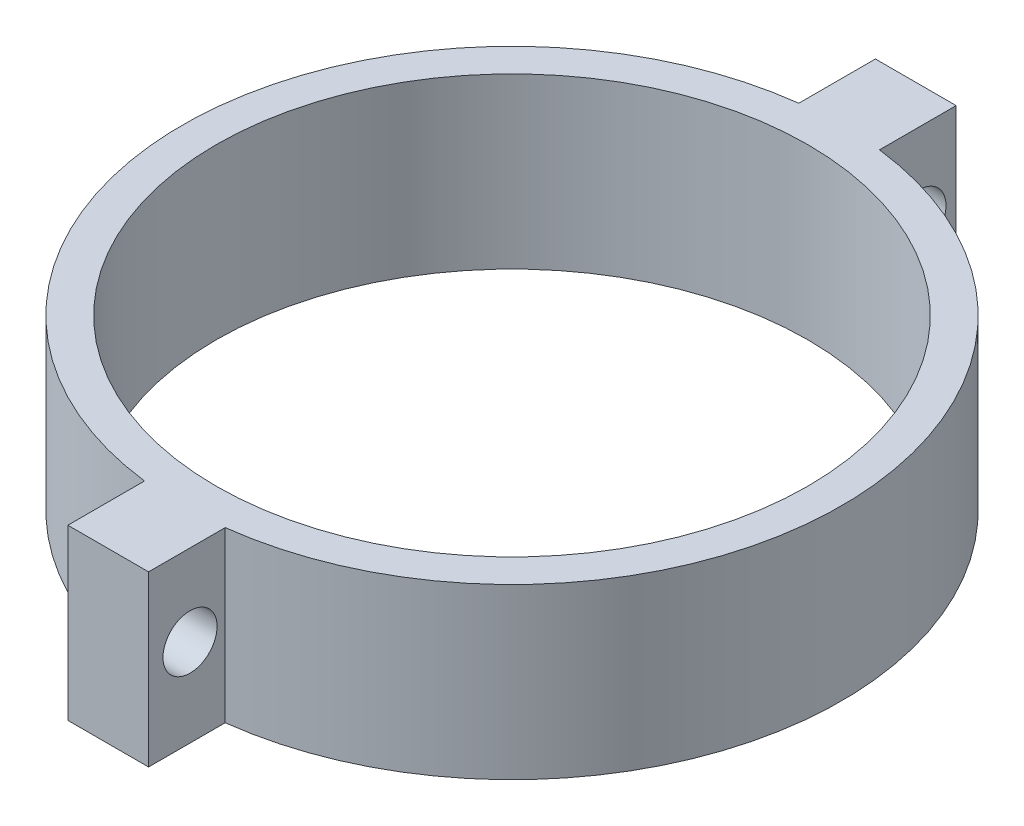
ISO-10303-21;
HEADER;
FILE_DESCRIPTION(('STEP AP214'),'2;1');
FILE_NAME('part.step','',(''),(''),'','','');
FILE_SCHEMA(('AUTOMOTIVE_DESIGN { 1 0 10303 214 1 1 1 1 }'));
ENDSEC;
DATA;
#1=APPLICATION_CONTEXT('core data for automotive mechanical design processes');
#2=APPLICATION_PROTOCOL_DEFINITION('international standard','automotive_design',2000,#1);
#3=PRODUCT_CONTEXT('',#1,'mechanical');
#4=PRODUCT('Part','Part','',(#3));
#5=PRODUCT_RELATED_PRODUCT_CATEGORY('part','',(#4));
#6=PRODUCT_DEFINITION_FORMATION('','',#4);
#7=PRODUCT_DEFINITION_CONTEXT('part definition',#1,'design');
#8=PRODUCT_DEFINITION('design','',#6,#7);
#9=PRODUCT_DEFINITION_SHAPE('','',#8);
#10=(LENGTH_UNIT() NAMED_UNIT(*) SI_UNIT(.MILLI.,.METRE.));
#11=(NAMED_UNIT(*) PLANE_ANGLE_UNIT() SI_UNIT($,.RADIAN.));
#12=(NAMED_UNIT(*) SI_UNIT($,.STERADIAN.) SOLID_ANGLE_UNIT());
#13=UNCERTAINTY_MEASURE_WITH_UNIT(LENGTH_MEASURE(1.E-05),#10,'distance_accuracy_value','');
#14=(GEOMETRIC_REPRESENTATION_CONTEXT(3) GLOBAL_UNCERTAINTY_ASSIGNED_CONTEXT((#13)) GLOBAL_UNIT_ASSIGNED_CONTEXT((#10,
#11,#12)) REPRESENTATION_CONTEXT('',''));
#15=CARTESIAN_POINT('',(0.,0.,0.));
#16=DIRECTION('',(0.,0.,1.));
#17=DIRECTION('',(1.,0.,0.));
#18=AXIS2_PLACEMENT_3D('',#15,#16,#17);
#19=CARTESIAN_POINT('',(0.,10.,0.));
#20=DIRECTION('',(0.,-1.,0.));
#21=DIRECTION('',(0.,0.,-1.));
#22=AXIS2_PLACEMENT_3D('',#19,#20,#21);
#23=CYLINDRICAL_SURFACE('',#22,19.5);
#24=CARTESIAN_POINT('',(0.,0.,0.));
#25=DIRECTION('',(0.,1.,0.));
#26=DIRECTION('',(0.,0.,1.));
#27=AXIS2_PLACEMENT_3D('',#24,#25,#26);
#28=CIRCLE('',#27,19.5);
#29=CARTESIAN_POINT('',(2.38752216255671,0.,19.3532875223643));
#30=VERTEX_POINT('',#29);
#31=CARTESIAN_POINT('',(2.38752216255671,0.,-19.3532875223643));
#32=VERTEX_POINT('',#31);
#33=EDGE_CURVE('E152',#30,#32,#28,.T.);
#34=ORIENTED_EDGE('',*,*,#33,.T.);
#35=DIRECTION('',(0.,-1.,0.));
#36=VECTOR('',#35,1.);
#37=CARTESIAN_POINT('',(2.38752216255671,10.,-19.3532875223643));
#38=LINE('',#37,#36);
#39=CARTESIAN_POINT('',(2.38752216255671,10.,-19.3532875223643));
#40=VERTEX_POINT('',#39);
#41=EDGE_CURVE('E11',#40,#32,#38,.T.);
#42=ORIENTED_EDGE('',*,*,#41,.F.);
#43=CARTESIAN_POINT('',(0.,10.,0.));
#44=DIRECTION('',(0.,1.,0.));
#45=DIRECTION('',(0.,0.,1.));
#46=AXIS2_PLACEMENT_3D('',#43,#44,#45);
#47=CIRCLE('',#46,19.5);
#48=CARTESIAN_POINT('',(2.38752216255671,10.,19.3532875223643));
#49=VERTEX_POINT('',#48);
#50=EDGE_CURVE('E210',#49,#40,#47,.T.);
#51=ORIENTED_EDGE('',*,*,#50,.F.);
#52=DIRECTION('',(0.,-1.,0.));
#53=VECTOR('',#52,1.);
#54=CARTESIAN_POINT('',(2.38752216255671,10.,19.3532875223643));
#55=LINE('',#54,#53);
#56=EDGE_CURVE('E62',#49,#30,#55,.T.);
#57=ORIENTED_EDGE('',*,*,#56,.T.);
#58=EDGE_LOOP('',(#34,#42,#51,#57));
#59=FACE_BOUND('',#58,.T.);
#60=ADVANCED_FACE('F43',(#59),#23,.T.);
#61=CARTESIAN_POINT('',(2.38752216255671,10.,0.));
#62=DIRECTION('',(-1.,0.,0.));
#63=DIRECTION('',(0.,0.,1.));
#64=AXIS2_PLACEMENT_3D('',#61,#62,#63);
#65=PLANE('',#64);
#66=CARTESIAN_POINT('',(2.38752216255671,5.18275767983805,-21.6873794233441));
#67=DIRECTION('',(-1.,0.,0.));
#68=DIRECTION('',(0.,0.,1.));
#69=AXIS2_PLACEMENT_3D('',#66,#67,#68);
#70=CIRCLE('',#69,1.6);
#71=CARTESIAN_POINT('',(2.38752216255671,5.18275767983805,-20.0873794233441));
#72=VERTEX_POINT('',#71);
#73=EDGE_CURVE('E153',#72,#72,#70,.T.);
#74=ORIENTED_EDGE('',*,*,#73,.T.);
#75=EDGE_LOOP('',(#74));
#76=FACE_BOUND('',#75,.T.);
#77=DIRECTION('',(0.,0.,-1.));
#78=VECTOR('',#77,1.);
#79=CARTESIAN_POINT('',(2.38752216255671,0.,0.));
#80=LINE('',#79,#78);
#81=CARTESIAN_POINT('',(2.38752216255671,0.,-23.8864412418474));
#82=VERTEX_POINT('',#81);
#83=EDGE_CURVE('E156',#32,#82,#80,.T.);
#84=ORIENTED_EDGE('',*,*,#83,.T.);
#85=DIRECTION('',(0.,-1.,0.));
#86=VECTOR('',#85,1.);
#87=CARTESIAN_POINT('',(2.38752216255671,10.,-23.8864412418474));
#88=LINE('',#87,#86);
#89=CARTESIAN_POINT('',(2.38752216255671,10.,-23.8864412418474));
#90=VERTEX_POINT('',#89);
#91=EDGE_CURVE('E54',#90,#82,#88,.T.);
#92=ORIENTED_EDGE('',*,*,#91,.F.);
#93=DIRECTION('',(0.,0.,-1.));
#94=VECTOR('',#93,1.);
#95=CARTESIAN_POINT('',(2.38752216255671,10.,0.));
#96=LINE('',#95,#94);
#97=EDGE_CURVE('E100',#40,#90,#96,.T.);
#98=ORIENTED_EDGE('',*,*,#97,.F.);
#99=ORIENTED_EDGE('',*,*,#41,.T.);
#100=EDGE_LOOP('',(#84,#92,#98,#99));
#101=FACE_BOUND('',#100,.T.);
#102=ADVANCED_FACE('F242',(#76,#101),#65,.F.);
#103=CARTESIAN_POINT('',(0.,10.,-23.8864412418474));
#104=DIRECTION('',(0.,0.,1.));
#105=DIRECTION('',(1.,0.,0.));
#106=AXIS2_PLACEMENT_3D('',#103,#104,#105);
#107=PLANE('',#106);
#108=DIRECTION('',(-1.,0.,0.));
#109=VECTOR('',#108,1.);
#110=CARTESIAN_POINT('',(0.,0.,-23.8864412418474));
#111=LINE('',#110,#109);
#112=CARTESIAN_POINT('',(-2.38752216255671,0.,-23.8864412418474));
#113=VERTEX_POINT('',#112);
#114=EDGE_CURVE('E160',#82,#113,#111,.T.);
#115=ORIENTED_EDGE('',*,*,#114,.T.);
#116=DIRECTION('',(0.,-1.,0.));
#117=VECTOR('',#116,1.);
#118=CARTESIAN_POINT('',(-2.38752216255671,10.,-23.8864412418474));
#119=LINE('',#118,#117);
#120=CARTESIAN_POINT('',(-2.38752216255671,10.,-23.8864412418474));
#121=VERTEX_POINT('',#120);
#122=EDGE_CURVE('E187',#121,#113,#119,.T.);
#123=ORIENTED_EDGE('',*,*,#122,.F.);
#124=DIRECTION('',(-1.,0.,0.));
#125=VECTOR('',#124,1.);
#126=CARTESIAN_POINT('',(0.,10.,-23.8864412418474));
#127=LINE('',#126,#125);
#128=EDGE_CURVE('E197',#90,#121,#127,.T.);
#129=ORIENTED_EDGE('',*,*,#128,.F.);
#130=ORIENTED_EDGE('',*,*,#91,.T.);
#131=EDGE_LOOP('',(#115,#123,#129,#130));
#132=FACE_BOUND('',#131,.T.);
#133=ADVANCED_FACE('F195',(#132),#107,.F.);
#134=CARTESIAN_POINT('',(-2.38752216255671,10.,0.));
#135=DIRECTION('',(-1.,0.,0.));
#136=DIRECTION('',(0.,0.,1.));
#137=AXIS2_PLACEMENT_3D('',#134,#135,#136);
#138=PLANE('',#137);
#139=CARTESIAN_POINT('',(-2.38752216255671,5.18275767983805,-21.6873794233441));
#140=DIRECTION('',(-1.,0.,0.));
#141=DIRECTION('',(0.,0.,1.));
#142=AXIS2_PLACEMENT_3D('',#139,#140,#141);
#143=CIRCLE('',#142,1.6);
#144=CARTESIAN_POINT('',(-2.38752216255671,5.18275767983805,-20.0873794233441));
#145=VERTEX_POINT('',#144);
#146=EDGE_CURVE('E226',#145,#145,#143,.T.);
#147=ORIENTED_EDGE('',*,*,#146,.F.);
#148=EDGE_LOOP('',(#147));
#149=FACE_BOUND('',#148,.T.);
#150=DIRECTION('',(0.,0.,-1.));
#151=VECTOR('',#150,1.);
#152=CARTESIAN_POINT('',(-2.38752216255671,0.,0.));
#153=LINE('',#152,#151);
#154=CARTESIAN_POINT('',(-2.38752216255671,0.,-19.3532875223643));
#155=VERTEX_POINT('',#154);
#156=EDGE_CURVE('E164',#155,#113,#153,.T.);
#157=ORIENTED_EDGE('',*,*,#156,.F.);
#158=DIRECTION('',(0.,-1.,0.));
#159=VECTOR('',#158,1.);
#160=CARTESIAN_POINT('',(-2.38752216255671,10.,-19.3532875223643));
#161=LINE('',#160,#159);
#162=CARTESIAN_POINT('',(-2.38752216255671,10.,-19.3532875223643));
#163=VERTEX_POINT('',#162);
#164=EDGE_CURVE('E184',#163,#155,#161,.T.);
#165=ORIENTED_EDGE('',*,*,#164,.F.);
#166=DIRECTION('',(0.,0.,-1.));
#167=VECTOR('',#166,1.);
#168=CARTESIAN_POINT('',(-2.38752216255671,10.,0.));
#169=LINE('',#168,#167);
#170=EDGE_CURVE('E205',#163,#121,#169,.T.);
#171=ORIENTED_EDGE('',*,*,#170,.T.);
#172=ORIENTED_EDGE('',*,*,#122,.T.);
#173=EDGE_LOOP('',(#157,#165,#171,#172));
#174=FACE_BOUND('',#173,.T.);
#175=ADVANCED_FACE('F203',(#149,#174),#138,.T.);
#176=CARTESIAN_POINT('',(-2.38752216255671,0.,19.3532875223643));
#177=VERTEX_POINT('',#176);
#178=EDGE_CURVE('E157',#155,#177,#28,.T.);
#179=ORIENTED_EDGE('',*,*,#178,.T.);
#180=DIRECTION('',(0.,-1.,0.));
#181=VECTOR('',#180,1.);
#182=CARTESIAN_POINT('',(-2.38752216255671,10.,19.3532875223643));
#183=LINE('',#182,#181);
#184=CARTESIAN_POINT('',(-2.38752216255671,10.,19.3532875223643));
#185=VERTEX_POINT('',#184);
#186=EDGE_CURVE('E138',#185,#177,#183,.T.);
#187=ORIENTED_EDGE('',*,*,#186,.F.);
#188=EDGE_CURVE('E124',#163,#185,#47,.T.);
#189=ORIENTED_EDGE('',*,*,#188,.F.);
#190=ORIENTED_EDGE('',*,*,#164,.T.);
#191=EDGE_LOOP('',(#179,#187,#189,#190));
#192=FACE_BOUND('',#191,.T.);
#193=ADVANCED_FACE('F251',(#192),#23,.T.);
#194=CARTESIAN_POINT('',(-2.38752216255671,10.,0.));
#195=DIRECTION('',(1.,0.,0.));
#196=DIRECTION('',(0.,0.,-1.));
#197=AXIS2_PLACEMENT_3D('',#194,#195,#196);
#198=PLANE('',#197);
#199=CARTESIAN_POINT('',(-2.38752216255671,5.18275767983805,21.4340013510521));
#200=DIRECTION('',(-1.,0.,0.));
#201=DIRECTION('',(0.,0.,1.));
#202=AXIS2_PLACEMENT_3D('',#199,#200,#201);
#203=CIRCLE('',#202,1.6);
#204=CARTESIAN_POINT('',(-2.38752216255671,5.18275767983805,23.0340013510521));
#205=VERTEX_POINT('',#204);
#206=EDGE_CURVE('E222',#205,#205,#203,.T.);
#207=ORIENTED_EDGE('',*,*,#206,.F.);
#208=EDGE_LOOP('',(#207));
#209=FACE_BOUND('',#208,.T.);
#210=DIRECTION('',(0.,0.,1.));
#211=VECTOR('',#210,1.);
#212=CARTESIAN_POINT('',(-2.38752216255671,0.,0.));
#213=LINE('',#212,#211);
#214=CARTESIAN_POINT('',(-2.38752216255671,0.,23.8864412418474));
#215=VERTEX_POINT('',#214);
#216=EDGE_CURVE('E134',#177,#215,#213,.T.);
#217=ORIENTED_EDGE('',*,*,#216,.T.);
#218=DIRECTION('',(0.,-1.,0.));
#219=VECTOR('',#218,1.);
#220=CARTESIAN_POINT('',(-2.38752216255671,10.,23.8864412418474));
#221=LINE('',#220,#219);
#222=CARTESIAN_POINT('',(-2.38752216255671,10.,23.8864412418474));
#223=VERTEX_POINT('',#222);
#224=EDGE_CURVE('E131',#223,#215,#221,.T.);
#225=ORIENTED_EDGE('',*,*,#224,.F.);
#226=DIRECTION('',(0.,0.,1.));
#227=VECTOR('',#226,1.);
#228=CARTESIAN_POINT('',(-2.38752216255671,10.,0.));
#229=LINE('',#228,#227);
#230=EDGE_CURVE('E116',#185,#223,#229,.T.);
#231=ORIENTED_EDGE('',*,*,#230,.F.);
#232=ORIENTED_EDGE('',*,*,#186,.T.);
#233=EDGE_LOOP('',(#217,#225,#231,#232));
#234=FACE_BOUND('',#233,.T.);
#235=ADVANCED_FACE('F132',(#209,#234),#198,.F.);
#236=CARTESIAN_POINT('',(0.,10.,23.8864412418474));
#237=DIRECTION('',(0.,0.,1.));
#238=DIRECTION('',(1.,0.,0.));
#239=AXIS2_PLACEMENT_3D('',#236,#237,#238);
#240=PLANE('',#239);
#241=DIRECTION('',(-1.,0.,0.));
#242=VECTOR('',#241,1.);
#243=CARTESIAN_POINT('',(0.,0.,23.8864412418474));
#244=LINE('',#243,#242);
#245=CARTESIAN_POINT('',(2.38752216255671,0.,23.8864412418474));
#246=VERTEX_POINT('',#245);
#247=EDGE_CURVE('E170',#246,#215,#244,.T.);
#248=ORIENTED_EDGE('',*,*,#247,.F.);
#249=DIRECTION('',(0.,-1.,0.));
#250=VECTOR('',#249,1.);
#251=CARTESIAN_POINT('',(2.38752216255671,10.,23.8864412418474));
#252=LINE('',#251,#250);
#253=CARTESIAN_POINT('',(2.38752216255671,10.,23.8864412418474));
#254=VERTEX_POINT('',#253);
#255=EDGE_CURVE('E88',#254,#246,#252,.T.);
#256=ORIENTED_EDGE('',*,*,#255,.F.);
#257=DIRECTION('',(-1.,0.,0.));
#258=VECTOR('',#257,1.);
#259=CARTESIAN_POINT('',(0.,10.,23.8864412418474));
#260=LINE('',#259,#258);
#261=EDGE_CURVE('E121',#254,#223,#260,.T.);
#262=ORIENTED_EDGE('',*,*,#261,.T.);
#263=ORIENTED_EDGE('',*,*,#224,.T.);
#264=EDGE_LOOP('',(#248,#256,#262,#263));
#265=FACE_BOUND('',#264,.T.);
#266=ADVANCED_FACE('F140',(#265),#240,.T.);
#267=CARTESIAN_POINT('',(0.,10.,0.));
#268=DIRECTION('',(0.,-1.,0.));
#269=DIRECTION('',(0.,0.,-1.));
#270=AXIS2_PLACEMENT_3D('',#267,#268,#269);
#271=CYLINDRICAL_SURFACE('',#270,17.5);
#272=CARTESIAN_POINT('',(0.,10.,0.));
#273=DIRECTION('',(0.,1.,0.));
#274=DIRECTION('',(0.,0.,1.));
#275=AXIS2_PLACEMENT_3D('',#272,#273,#274);
#276=CIRCLE('',#275,17.5);
#277=CARTESIAN_POINT('',(0.,10.,17.5));
#278=VERTEX_POINT('',#277);
#279=EDGE_CURVE('E177',#278,#278,#276,.T.);
#280=ORIENTED_EDGE('',*,*,#279,.T.);
#281=EDGE_LOOP('',(#280));
#282=FACE_BOUND('',#281,.T.);
#283=CARTESIAN_POINT('',(0.,0.,0.));
#284=DIRECTION('',(0.,1.,0.));
#285=DIRECTION('',(0.,0.,1.));
#286=AXIS2_PLACEMENT_3D('',#283,#284,#285);
#287=CIRCLE('',#286,17.5);
#288=CARTESIAN_POINT('',(0.,0.,17.5));
#289=VERTEX_POINT('',#288);
#290=EDGE_CURVE('E148',#289,#289,#287,.T.);
#291=ORIENTED_EDGE('',*,*,#290,.F.);
#292=EDGE_LOOP('',(#291));
#293=FACE_BOUND('',#292,.T.);
#294=ADVANCED_FACE('F45',(#282,#293),#271,.F.);
#295=CARTESIAN_POINT('',(2.38752216255671,10.,0.));
#296=DIRECTION('',(1.,0.,0.));
#297=DIRECTION('',(0.,0.,-1.));
#298=AXIS2_PLACEMENT_3D('',#295,#296,#297);
#299=PLANE('',#298);
#300=CARTESIAN_POINT('',(2.38752216255671,5.18275767983805,21.4340013510521));
#301=DIRECTION('',(1.,0.,0.));
#302=DIRECTION('',(0.,0.,-1.));
#303=AXIS2_PLACEMENT_3D('',#300,#301,#302);
#304=CIRCLE('',#303,1.6);
#305=CARTESIAN_POINT('',(2.38752216255671,5.18275767983805,19.8340013510521));
#306=VERTEX_POINT('',#305);
#307=EDGE_CURVE('E47',#306,#306,#304,.T.);
#308=ORIENTED_EDGE('',*,*,#307,.F.);
#309=EDGE_LOOP('',(#308));
#310=FACE_BOUND('',#309,.T.);
#311=DIRECTION('',(0.,0.,1.));
#312=VECTOR('',#311,1.);
#313=CARTESIAN_POINT('',(2.38752216255671,0.,0.));
#314=LINE('',#313,#312);
#315=EDGE_CURVE('E173',#30,#246,#314,.T.);
#316=ORIENTED_EDGE('',*,*,#315,.F.);
#317=ORIENTED_EDGE('',*,*,#56,.F.);
#318=DIRECTION('',(0.,0.,1.));
#319=VECTOR('',#318,1.);
#320=CARTESIAN_POINT('',(2.38752216255671,10.,0.));
#321=LINE('',#320,#319);
#322=EDGE_CURVE('E142',#49,#254,#321,.T.);
#323=ORIENTED_EDGE('',*,*,#322,.T.);
#324=ORIENTED_EDGE('',*,*,#255,.T.);
#325=EDGE_LOOP('',(#316,#317,#323,#324));
#326=FACE_BOUND('',#325,.T.);
#327=ADVANCED_FACE('F238',(#310,#326),#299,.T.);
#328=CARTESIAN_POINT('',(0.,10.,0.));
#329=DIRECTION('',(0.,1.,0.));
#330=DIRECTION('',(0.,0.,1.));
#331=AXIS2_PLACEMENT_3D('',#328,#329,#330);
#332=PLANE('',#331);
#333=ORIENTED_EDGE('',*,*,#279,.F.);
#334=EDGE_LOOP('',(#333));
#335=FACE_BOUND('',#334,.T.);
#336=ORIENTED_EDGE('',*,*,#50,.T.);
#337=ORIENTED_EDGE('',*,*,#97,.T.);
#338=ORIENTED_EDGE('',*,*,#128,.T.);
#339=ORIENTED_EDGE('',*,*,#170,.F.);
#340=ORIENTED_EDGE('',*,*,#188,.T.);
#341=ORIENTED_EDGE('',*,*,#230,.T.);
#342=ORIENTED_EDGE('',*,*,#261,.F.);
#343=ORIENTED_EDGE('',*,*,#322,.F.);
#344=EDGE_LOOP('',(#336,#337,#338,#339,#340,#341,#342,#343));
#345=FACE_BOUND('',#344,.T.);
#346=ADVANCED_FACE('F118',(#335,#345),#332,.T.);
#347=CARTESIAN_POINT('',(0.,0.,0.));
#348=DIRECTION('',(0.,1.,0.));
#349=DIRECTION('',(0.,0.,1.));
#350=AXIS2_PLACEMENT_3D('',#347,#348,#349);
#351=PLANE('',#350);
#352=ORIENTED_EDGE('',*,*,#290,.T.);
#353=EDGE_LOOP('',(#352));
#354=FACE_BOUND('',#353,.T.);
#355=ORIENTED_EDGE('',*,*,#33,.F.);
#356=ORIENTED_EDGE('',*,*,#315,.T.);
#357=ORIENTED_EDGE('',*,*,#247,.T.);
#358=ORIENTED_EDGE('',*,*,#216,.F.);
#359=ORIENTED_EDGE('',*,*,#178,.F.);
#360=ORIENTED_EDGE('',*,*,#156,.T.);
#361=ORIENTED_EDGE('',*,*,#114,.F.);
#362=ORIENTED_EDGE('',*,*,#83,.F.);
#363=EDGE_LOOP('',(#355,#356,#357,#358,#359,#360,#361,#362));
#364=FACE_BOUND('',#363,.T.);
#365=ADVANCED_FACE('F199',(#354,#364),#351,.F.);
#366=CARTESIAN_POINT('',(7.61247783744329,5.18275767983805,21.4340013510521));
#367=DIRECTION('',(-1.,0.,0.));
#368=DIRECTION('',(0.,0.,1.));
#369=AXIS2_PLACEMENT_3D('',#366,#367,#368);
#370=CYLINDRICAL_SURFACE('',#369,1.6);
#371=ORIENTED_EDGE('',*,*,#307,.T.);
#372=EDGE_LOOP('',(#371));
#373=FACE_BOUND('',#372,.T.);
#374=ORIENTED_EDGE('',*,*,#206,.T.);
#375=EDGE_LOOP('',(#374));
#376=FACE_BOUND('',#375,.T.);
#377=ADVANCED_FACE('F235',(#373,#376),#370,.F.);
#378=CARTESIAN_POINT('',(7.61247783744329,5.18275767983805,-21.6873794233441));
#379=DIRECTION('',(-1.,0.,0.));
#380=DIRECTION('',(0.,0.,1.));
#381=AXIS2_PLACEMENT_3D('',#378,#379,#380);
#382=CYLINDRICAL_SURFACE('',#381,1.6);
#383=ORIENTED_EDGE('',*,*,#146,.T.);
#384=EDGE_LOOP('',(#383));
#385=FACE_BOUND('',#384,.T.);
#386=ORIENTED_EDGE('',*,*,#73,.F.);
#387=EDGE_LOOP('',(#386));
#388=FACE_BOUND('',#387,.T.);
#389=ADVANCED_FACE('F271',(#385,#388),#382,.F.);
#390=CLOSED_SHELL('',(#60,#102,#133,#175,#193,#235,#266,#294,#327,#346,#365,#377,#389));
#391=MANIFOLD_SOLID_BREP('B2',#390);
#392=ADVANCED_BREP_SHAPE_REPRESENTATION('',(#18,#391),#14);
#393=SHAPE_DEFINITION_REPRESENTATION(#9,#392);
ENDSEC;
END-ISO-10303-21;
